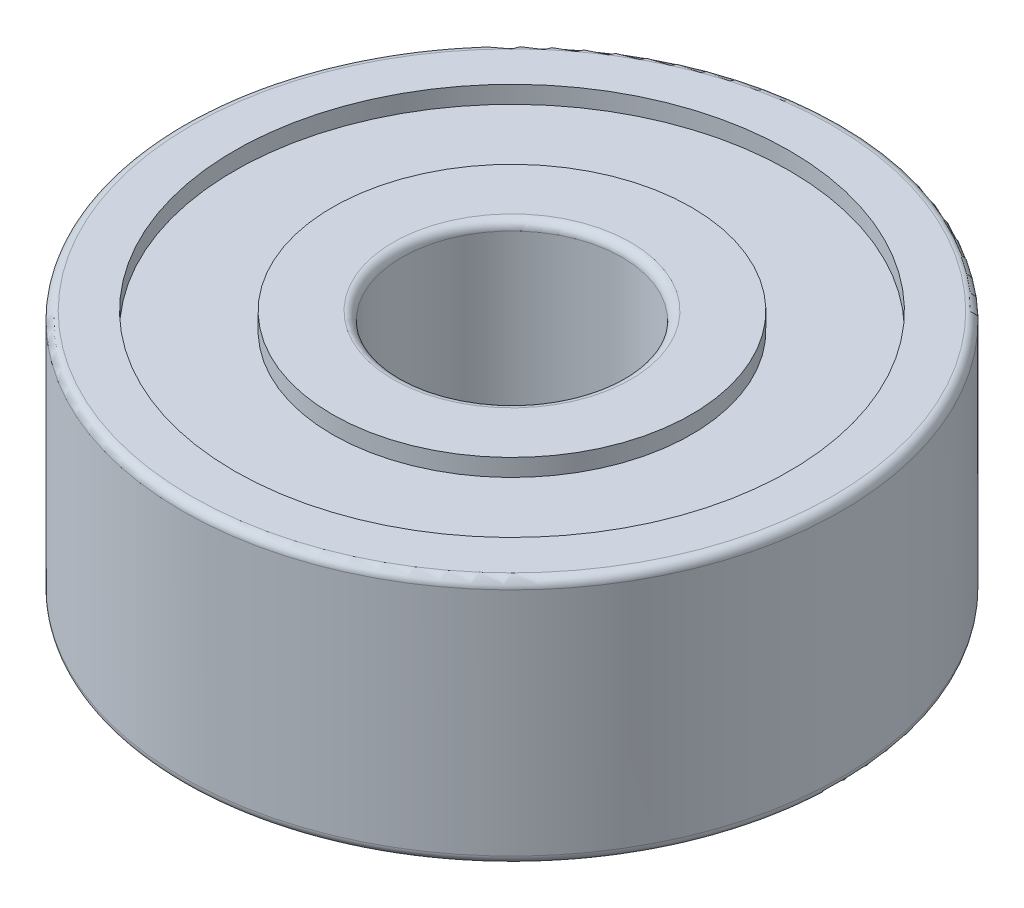
ISO-10303-21;
HEADER;
FILE_DESCRIPTION(('STEP AP214'),'2;1');
FILE_NAME('part.step','',(''),(''),'','','');
FILE_SCHEMA(('AUTOMOTIVE_DESIGN { 1 0 10303 214 1 1 1 1 }'));
ENDSEC;
DATA;
#1=APPLICATION_CONTEXT('core data for automotive mechanical design processes');
#2=APPLICATION_PROTOCOL_DEFINITION('international standard','automotive_design',2000,#1);
#3=PRODUCT_CONTEXT('',#1,'mechanical');
#4=PRODUCT('Part','Part','',(#3));
#5=PRODUCT_RELATED_PRODUCT_CATEGORY('part','',(#4));
#6=PRODUCT_DEFINITION_FORMATION('','',#4);
#7=PRODUCT_DEFINITION_CONTEXT('part definition',#1,'design');
#8=PRODUCT_DEFINITION('design','',#6,#7);
#9=PRODUCT_DEFINITION_SHAPE('','',#8);
#10=(LENGTH_UNIT() NAMED_UNIT(*) SI_UNIT(.MILLI.,.METRE.));
#11=(NAMED_UNIT(*) PLANE_ANGLE_UNIT() SI_UNIT($,.RADIAN.));
#12=(NAMED_UNIT(*) SI_UNIT($,.STERADIAN.) SOLID_ANGLE_UNIT());
#13=UNCERTAINTY_MEASURE_WITH_UNIT(LENGTH_MEASURE(1.E-05),#10,'distance_accuracy_value','');
#14=(GEOMETRIC_REPRESENTATION_CONTEXT(3) GLOBAL_UNCERTAINTY_ASSIGNED_CONTEXT((#13)) GLOBAL_UNIT_ASSIGNED_CONTEXT((#10,
#11,#12)) REPRESENTATION_CONTEXT('',''));
#15=CARTESIAN_POINT('',(0.,0.,0.));
#16=DIRECTION('',(0.,0.,1.));
#17=DIRECTION('',(1.,0.,0.));
#18=AXIS2_PLACEMENT_3D('',#15,#16,#17);
#19=CARTESIAN_POINT('',(3.175,-3.57251,0.));
#20=DIRECTION('',(0.,-1.,0.));
#21=DIRECTION('',(0.,0.,-1.));
#22=AXIS2_PLACEMENT_3D('',#19,#20,#21);
#23=PLANE('',#22);
#24=CARTESIAN_POINT('',(0.,-3.57251,0.));
#25=DIRECTION('',(0.,-1.,0.));
#26=DIRECTION('',(0.,0.,-1.));
#27=AXIS2_PLACEMENT_3D('',#24,#25,#26);
#28=CIRCLE('',#27,3.425000008);
#29=CARTESIAN_POINT('',(0.,-3.57251,-3.425000008));
#30=VERTEX_POINT('',#29);
#31=EDGE_CURVE('E38',#30,#30,#28,.F.);
#32=ORIENTED_EDGE('',*,*,#31,.T.);
#33=EDGE_LOOP('',(#32));
#34=FACE_BOUND('',#33,.T.);
#35=CARTESIAN_POINT('',(0.,-3.57251,0.));
#36=DIRECTION('',(0.,-1.,0.));
#37=DIRECTION('',(0.,0.,-1.));
#38=AXIS2_PLACEMENT_3D('',#35,#36,#37);
#39=CIRCLE('',#38,5.175000064);
#40=CARTESIAN_POINT('',(0.,-3.57251,-5.175000064));
#41=VERTEX_POINT('',#40);
#42=EDGE_CURVE('E47',#41,#41,#39,.T.);
#43=ORIENTED_EDGE('',*,*,#42,.T.);
#44=EDGE_LOOP('',(#43));
#45=FACE_BOUND('',#44,.T.);
#46=ADVANCED_FACE('F15',(#34,#45),#23,.T.);
#47=CARTESIAN_POINT('',(0.,0.,0.));
#48=DIRECTION('',(0.,-1.,0.));
#49=DIRECTION('',(0.,0.,-1.));
#50=AXIS2_PLACEMENT_3D('',#47,#48,#49);
#51=CYLINDRICAL_SURFACE('',#50,5.175000064);
#52=CARTESIAN_POINT('',(0.,-3.072509984,0.));
#53=DIRECTION('',(0.,-1.,0.));
#54=DIRECTION('',(0.,0.,-1.));
#55=AXIS2_PLACEMENT_3D('',#52,#53,#54);
#56=CIRCLE('',#55,5.175000064);
#57=CARTESIAN_POINT('',(0.,-3.072509984,-5.175000064));
#58=VERTEX_POINT('',#57);
#59=EDGE_CURVE('E50',#58,#58,#56,.T.);
#60=ORIENTED_EDGE('',*,*,#59,.T.);
#61=EDGE_LOOP('',(#60));
#62=FACE_BOUND('',#61,.T.);
#63=ORIENTED_EDGE('',*,*,#42,.F.);
#64=EDGE_LOOP('',(#63));
#65=FACE_BOUND('',#64,.T.);
#66=ADVANCED_FACE('F92',(#62,#65),#51,.T.);
#67=CARTESIAN_POINT('',(5.175000064,-3.072509984,0.));
#68=DIRECTION('',(0.,-1.,0.));
#69=DIRECTION('',(0.,0.,-1.));
#70=AXIS2_PLACEMENT_3D('',#67,#68,#69);
#71=PLANE('',#70);
#72=CARTESIAN_POINT('',(0.,-3.072509984,0.));
#73=DIRECTION('',(0.,-1.,0.));
#74=DIRECTION('',(0.,0.,-1.));
#75=AXIS2_PLACEMENT_3D('',#72,#73,#74);
#76=CIRCLE('',#75,8.000000002);
#77=CARTESIAN_POINT('',(0.,-3.072509984,-8.000000002));
#78=VERTEX_POINT('',#77);
#79=EDGE_CURVE('E53',#78,#78,#76,.T.);
#80=ORIENTED_EDGE('',*,*,#79,.T.);
#81=EDGE_LOOP('',(#80));
#82=FACE_BOUND('',#81,.T.);
#83=ORIENTED_EDGE('',*,*,#59,.F.);
#84=EDGE_LOOP('',(#83));
#85=FACE_BOUND('',#84,.T.);
#86=ADVANCED_FACE('F99',(#82,#85),#71,.T.);
#87=CARTESIAN_POINT('',(0.,0.,0.));
#88=DIRECTION('',(0.,-1.,0.));
#89=DIRECTION('',(0.,0.,-1.));
#90=AXIS2_PLACEMENT_3D('',#87,#88,#89);
#91=CYLINDRICAL_SURFACE('',#90,8.000000002);
#92=CARTESIAN_POINT('',(0.,-3.57251,0.));
#93=DIRECTION('',(0.,-1.,0.));
#94=DIRECTION('',(0.,0.,-1.));
#95=AXIS2_PLACEMENT_3D('',#92,#93,#94);
#96=CIRCLE('',#95,8.000000002);
#97=CARTESIAN_POINT('',(0.,-3.57251,-8.000000002));
#98=VERTEX_POINT('',#97);
#99=EDGE_CURVE('E56',#98,#98,#96,.T.);
#100=ORIENTED_EDGE('',*,*,#99,.T.);
#101=EDGE_LOOP('',(#100));
#102=FACE_BOUND('',#101,.T.);
#103=ORIENTED_EDGE('',*,*,#79,.F.);
#104=EDGE_LOOP('',(#103));
#105=FACE_BOUND('',#104,.T.);
#106=ADVANCED_FACE('F126',(#102,#105),#91,.F.);
#107=CARTESIAN_POINT('',(8.000000002,-3.57251,0.));
#108=DIRECTION('',(0.,-1.,0.));
#109=DIRECTION('',(0.,0.,-1.));
#110=AXIS2_PLACEMENT_3D('',#107,#108,#109);
#111=PLANE('',#110);
#112=CARTESIAN_POINT('',(0.,-3.57251,0.));
#113=DIRECTION('',(0.,-1.,0.));
#114=DIRECTION('',(0.,0.,-1.));
#115=AXIS2_PLACEMENT_3D('',#112,#113,#114);
#116=CIRCLE('',#115,9.250000042);
#117=CARTESIAN_POINT('',(0.,-3.57251,-9.250000042));
#118=VERTEX_POINT('',#117);
#119=EDGE_CURVE('E30',#118,#118,#116,.T.);
#120=ORIENTED_EDGE('',*,*,#119,.T.);
#121=EDGE_LOOP('',(#120));
#122=FACE_BOUND('',#121,.T.);
#123=ORIENTED_EDGE('',*,*,#99,.F.);
#124=EDGE_LOOP('',(#123));
#125=FACE_BOUND('',#124,.T.);
#126=ADVANCED_FACE('F122',(#122,#125),#111,.T.);
#127=CARTESIAN_POINT('',(0.,0.,0.));
#128=DIRECTION('',(0.,-1.,0.));
#129=DIRECTION('',(0.,0.,-1.));
#130=AXIS2_PLACEMENT_3D('',#127,#128,#129);
#131=CYLINDRICAL_SURFACE('',#130,9.50000005);
#132=CARTESIAN_POINT('',(0.,-3.322509992,0.));
#133=DIRECTION('',(0.,-1.,0.));
#134=DIRECTION('',(0.,0.,-1.));
#135=AXIS2_PLACEMENT_3D('',#132,#133,#134);
#136=CIRCLE('',#135,9.50000005);
#137=CARTESIAN_POINT('',(0.,-3.322509992,-9.50000005));
#138=VERTEX_POINT('',#137);
#139=EDGE_CURVE('E22',#138,#138,#136,.F.);
#140=ORIENTED_EDGE('',*,*,#139,.T.);
#141=EDGE_LOOP('',(#140));
#142=FACE_BOUND('',#141,.T.);
#143=CARTESIAN_POINT('',(0.,3.322509992,0.));
#144=DIRECTION('',(0.,1.,0.));
#145=DIRECTION('',(0.,0.,1.));
#146=AXIS2_PLACEMENT_3D('',#143,#144,#145);
#147=CIRCLE('',#146,9.50000005);
#148=CARTESIAN_POINT('',(0.,3.322509992,9.50000005));
#149=VERTEX_POINT('',#148);
#150=EDGE_CURVE('E26',#149,#149,#147,.F.);
#151=ORIENTED_EDGE('',*,*,#150,.T.);
#152=EDGE_LOOP('',(#151));
#153=FACE_BOUND('',#152,.T.);
#154=ADVANCED_FACE('F125',(#142,#153),#131,.T.);
#155=CARTESIAN_POINT('',(9.50000005,3.57251,0.));
#156=DIRECTION('',(0.,1.,0.));
#157=DIRECTION('',(0.,0.,1.));
#158=AXIS2_PLACEMENT_3D('',#155,#156,#157);
#159=PLANE('',#158);
#160=CARTESIAN_POINT('',(0.,3.57251,0.));
#161=DIRECTION('',(0.,1.,0.));
#162=DIRECTION('',(0.,0.,1.));
#163=AXIS2_PLACEMENT_3D('',#160,#161,#162);
#164=CIRCLE('',#163,9.250000042);
#165=CARTESIAN_POINT('',(0.,3.57251,9.250000042));
#166=VERTEX_POINT('',#165);
#167=EDGE_CURVE('E10',#166,#166,#164,.T.);
#168=ORIENTED_EDGE('',*,*,#167,.T.);
#169=EDGE_LOOP('',(#168));
#170=FACE_BOUND('',#169,.T.);
#171=CARTESIAN_POINT('',(0.,3.57251,0.));
#172=DIRECTION('',(0.,-1.,0.));
#173=DIRECTION('',(0.,0.,-1.));
#174=AXIS2_PLACEMENT_3D('',#171,#172,#173);
#175=CIRCLE('',#174,8.000000002);
#176=CARTESIAN_POINT('',(0.,3.57251,-8.000000002));
#177=VERTEX_POINT('',#176);
#178=EDGE_CURVE('E59',#177,#177,#175,.T.);
#179=ORIENTED_EDGE('',*,*,#178,.T.);
#180=EDGE_LOOP('',(#179));
#181=FACE_BOUND('',#180,.T.);
#182=ADVANCED_FACE('F146',(#170,#181),#159,.T.);
#183=CARTESIAN_POINT('',(0.,0.,0.));
#184=DIRECTION('',(0.,-1.,0.));
#185=DIRECTION('',(0.,0.,-1.));
#186=AXIS2_PLACEMENT_3D('',#183,#184,#185);
#187=CYLINDRICAL_SURFACE('',#186,8.000000002);
#188=CARTESIAN_POINT('',(0.,3.072509984,0.));
#189=DIRECTION('',(0.,-1.,0.));
#190=DIRECTION('',(0.,0.,-1.));
#191=AXIS2_PLACEMENT_3D('',#188,#189,#190);
#192=CIRCLE('',#191,8.000000002);
#193=CARTESIAN_POINT('',(0.,3.072509984,-8.000000002));
#194=VERTEX_POINT('',#193);
#195=EDGE_CURVE('E62',#194,#194,#192,.T.);
#196=ORIENTED_EDGE('',*,*,#195,.T.);
#197=EDGE_LOOP('',(#196));
#198=FACE_BOUND('',#197,.T.);
#199=ORIENTED_EDGE('',*,*,#178,.F.);
#200=EDGE_LOOP('',(#199));
#201=FACE_BOUND('',#200,.T.);
#202=ADVANCED_FACE('F149',(#198,#201),#187,.F.);
#203=CARTESIAN_POINT('',(8.000000002,3.072509984,0.));
#204=DIRECTION('',(0.,1.,0.));
#205=DIRECTION('',(0.,0.,1.));
#206=AXIS2_PLACEMENT_3D('',#203,#204,#205);
#207=PLANE('',#206);
#208=CARTESIAN_POINT('',(0.,3.072509984,0.));
#209=DIRECTION('',(0.,-1.,0.));
#210=DIRECTION('',(0.,0.,-1.));
#211=AXIS2_PLACEMENT_3D('',#208,#209,#210);
#212=CIRCLE('',#211,5.175000064);
#213=CARTESIAN_POINT('',(0.,3.072509984,-5.175000064));
#214=VERTEX_POINT('',#213);
#215=EDGE_CURVE('E65',#214,#214,#212,.T.);
#216=ORIENTED_EDGE('',*,*,#215,.T.);
#217=EDGE_LOOP('',(#216));
#218=FACE_BOUND('',#217,.T.);
#219=ORIENTED_EDGE('',*,*,#195,.F.);
#220=EDGE_LOOP('',(#219));
#221=FACE_BOUND('',#220,.T.);
#222=ADVANCED_FACE('F89',(#218,#221),#207,.T.);
#223=CARTESIAN_POINT('',(0.,0.,0.));
#224=DIRECTION('',(0.,-1.,0.));
#225=DIRECTION('',(0.,0.,-1.));
#226=AXIS2_PLACEMENT_3D('',#223,#224,#225);
#227=CYLINDRICAL_SURFACE('',#226,5.175000064);
#228=CARTESIAN_POINT('',(0.,3.57251,0.));
#229=DIRECTION('',(0.,-1.,0.));
#230=DIRECTION('',(0.,0.,-1.));
#231=AXIS2_PLACEMENT_3D('',#228,#229,#230);
#232=CIRCLE('',#231,5.175000064);
#233=CARTESIAN_POINT('',(0.,3.57251,-5.175000064));
#234=VERTEX_POINT('',#233);
#235=EDGE_CURVE('E68',#234,#234,#232,.T.);
#236=ORIENTED_EDGE('',*,*,#235,.T.);
#237=EDGE_LOOP('',(#236));
#238=FACE_BOUND('',#237,.T.);
#239=ORIENTED_EDGE('',*,*,#215,.F.);
#240=EDGE_LOOP('',(#239));
#241=FACE_BOUND('',#240,.T.);
#242=ADVANCED_FACE('F72',(#238,#241),#227,.T.);
#243=CARTESIAN_POINT('',(5.175000064,3.57251,0.));
#244=DIRECTION('',(0.,1.,0.));
#245=DIRECTION('',(0.,0.,1.));
#246=AXIS2_PLACEMENT_3D('',#243,#244,#245);
#247=PLANE('',#246);
#248=CARTESIAN_POINT('',(0.,3.57251,0.));
#249=DIRECTION('',(0.,1.,0.));
#250=DIRECTION('',(0.,0.,1.));
#251=AXIS2_PLACEMENT_3D('',#248,#249,#250);
#252=CIRCLE('',#251,3.425000008);
#253=CARTESIAN_POINT('',(0.,3.57251,3.425000008));
#254=VERTEX_POINT('',#253);
#255=EDGE_CURVE('E35',#254,#254,#252,.F.);
#256=ORIENTED_EDGE('',*,*,#255,.T.);
#257=EDGE_LOOP('',(#256));
#258=FACE_BOUND('',#257,.T.);
#259=ORIENTED_EDGE('',*,*,#235,.F.);
#260=EDGE_LOOP('',(#259));
#261=FACE_BOUND('',#260,.T.);
#262=ADVANCED_FACE('F75',(#258,#261),#247,.T.);
#263=CARTESIAN_POINT('',(0.,0.,0.));
#264=DIRECTION('',(0.,-1.,0.));
#265=DIRECTION('',(0.,0.,-1.));
#266=AXIS2_PLACEMENT_3D('',#263,#264,#265);
#267=CYLINDRICAL_SURFACE('',#266,3.175);
#268=CARTESIAN_POINT('',(0.,-3.322509992,0.));
#269=DIRECTION('',(0.,-1.,0.));
#270=DIRECTION('',(0.,0.,-1.));
#271=AXIS2_PLACEMENT_3D('',#268,#269,#270);
#272=CIRCLE('',#271,3.175);
#273=CARTESIAN_POINT('',(0.,-3.322509992,-3.175));
#274=VERTEX_POINT('',#273);
#275=EDGE_CURVE('E41',#274,#274,#272,.T.);
#276=ORIENTED_EDGE('',*,*,#275,.T.);
#277=EDGE_LOOP('',(#276));
#278=FACE_BOUND('',#277,.T.);
#279=CARTESIAN_POINT('',(0.,3.322509992,0.));
#280=DIRECTION('',(0.,1.,0.));
#281=DIRECTION('',(0.,0.,1.));
#282=AXIS2_PLACEMENT_3D('',#279,#280,#281);
#283=CIRCLE('',#282,3.175);
#284=CARTESIAN_POINT('',(0.,3.322509992,3.175));
#285=VERTEX_POINT('',#284);
#286=EDGE_CURVE('E44',#285,#285,#283,.T.);
#287=ORIENTED_EDGE('',*,*,#286,.T.);
#288=EDGE_LOOP('',(#287));
#289=FACE_BOUND('',#288,.T.);
#290=ADVANCED_FACE('F77',(#278,#289),#267,.F.);
#291=CARTESIAN_POINT('',(0.,-3.322509992,0.));
#292=DIRECTION('',(0.,-1.,0.));
#293=DIRECTION('',(0.,0.,-1.));
#294=AXIS2_PLACEMENT_3D('',#291,#292,#293);
#295=TOROIDAL_SURFACE('',#294,3.425000008,0.250000008);
#296=ORIENTED_EDGE('',*,*,#31,.F.);
#297=EDGE_LOOP('',(#296));
#298=FACE_BOUND('',#297,.T.);
#299=ORIENTED_EDGE('',*,*,#275,.F.);
#300=EDGE_LOOP('',(#299));
#301=FACE_BOUND('',#300,.T.);
#302=ADVANCED_FACE('F86',(#298,#301),#295,.T.);
#303=CARTESIAN_POINT('',(0.,3.322509992,0.));
#304=DIRECTION('',(0.,1.,0.));
#305=DIRECTION('',(0.,0.,1.));
#306=AXIS2_PLACEMENT_3D('',#303,#304,#305);
#307=TOROIDAL_SURFACE('',#306,3.425000008,0.250000008);
#308=ORIENTED_EDGE('',*,*,#286,.F.);
#309=EDGE_LOOP('',(#308));
#310=FACE_BOUND('',#309,.T.);
#311=ORIENTED_EDGE('',*,*,#255,.F.);
#312=EDGE_LOOP('',(#311));
#313=FACE_BOUND('',#312,.T.);
#314=ADVANCED_FACE('F107',(#310,#313),#307,.T.);
#315=CARTESIAN_POINT('',(0.,-3.322509992,0.));
#316=DIRECTION('',(0.,-1.,0.));
#317=DIRECTION('',(0.,0.,-1.));
#318=AXIS2_PLACEMENT_3D('',#315,#316,#317);
#319=TOROIDAL_SURFACE('',#318,9.250000042,0.250000008);
#320=ORIENTED_EDGE('',*,*,#139,.F.);
#321=EDGE_LOOP('',(#320));
#322=FACE_BOUND('',#321,.T.);
#323=ORIENTED_EDGE('',*,*,#119,.F.);
#324=EDGE_LOOP('',(#323));
#325=FACE_BOUND('',#324,.T.);
#326=ADVANCED_FACE('F110',(#322,#325),#319,.T.);
#327=CARTESIAN_POINT('',(0.,3.322509992,0.));
#328=DIRECTION('',(0.,1.,0.));
#329=DIRECTION('',(0.,0.,1.));
#330=AXIS2_PLACEMENT_3D('',#327,#328,#329);
#331=TOROIDAL_SURFACE('',#330,9.250000042,0.250000008);
#332=ORIENTED_EDGE('',*,*,#167,.F.);
#333=EDGE_LOOP('',(#332));
#334=FACE_BOUND('',#333,.T.);
#335=ORIENTED_EDGE('',*,*,#150,.F.);
#336=EDGE_LOOP('',(#335));
#337=FACE_BOUND('',#336,.T.);
#338=ADVANCED_FACE('F17',(#334,#337),#331,.T.);
#339=CLOSED_SHELL('',(#46,#66,#86,#106,#126,#154,#182,#202,#222,#242,#262,#290,#302,#314,#326,#338));
#340=MANIFOLD_SOLID_BREP('B1',#339);
#341=ADVANCED_BREP_SHAPE_REPRESENTATION('',(#18,#340),#14);
#342=SHAPE_DEFINITION_REPRESENTATION(#9,#341);
ENDSEC;
END-ISO-10303-21;
